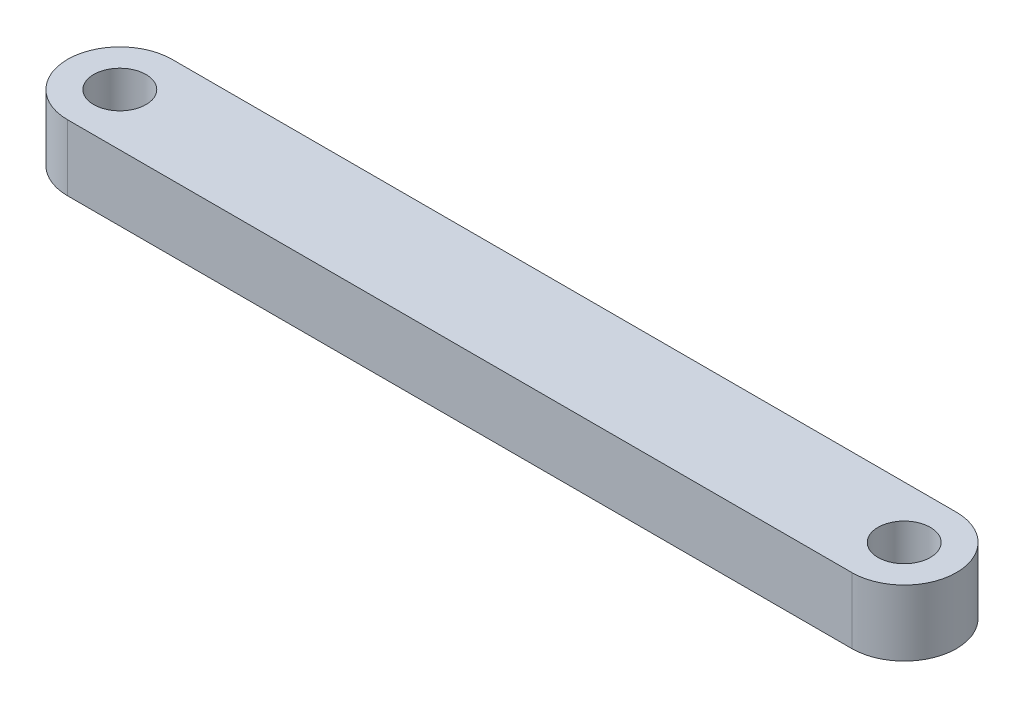
ISO-10303-21;
HEADER;
FILE_DESCRIPTION(('STEP AP214'),'2;1');
FILE_NAME('part.step','',(''),(''),'','','');
FILE_SCHEMA(('AUTOMOTIVE_DESIGN { 1 0 10303 214 1 1 1 1 }'));
ENDSEC;
DATA;
#1=APPLICATION_CONTEXT('core data for automotive mechanical design processes');
#2=APPLICATION_PROTOCOL_DEFINITION('international standard','automotive_design',2000,#1);
#3=PRODUCT_CONTEXT('',#1,'mechanical');
#4=PRODUCT('Part','Part','',(#3));
#5=PRODUCT_RELATED_PRODUCT_CATEGORY('part','',(#4));
#6=PRODUCT_DEFINITION_FORMATION('','',#4);
#7=PRODUCT_DEFINITION_CONTEXT('part definition',#1,'design');
#8=PRODUCT_DEFINITION('design','',#6,#7);
#9=PRODUCT_DEFINITION_SHAPE('','',#8);
#10=(LENGTH_UNIT() NAMED_UNIT(*) SI_UNIT(.MILLI.,.METRE.));
#11=(NAMED_UNIT(*) PLANE_ANGLE_UNIT() SI_UNIT($,.RADIAN.));
#12=(NAMED_UNIT(*) SI_UNIT($,.STERADIAN.) SOLID_ANGLE_UNIT());
#13=UNCERTAINTY_MEASURE_WITH_UNIT(LENGTH_MEASURE(1.E-05),#10,'distance_accuracy_value','');
#14=(GEOMETRIC_REPRESENTATION_CONTEXT(3) GLOBAL_UNCERTAINTY_ASSIGNED_CONTEXT((#13)) GLOBAL_UNIT_ASSIGNED_CONTEXT((#10,
#11,#12)) REPRESENTATION_CONTEXT('',''));
#15=CARTESIAN_POINT('',(0.,0.,0.));
#16=DIRECTION('',(0.,0.,1.));
#17=DIRECTION('',(1.,0.,0.));
#18=AXIS2_PLACEMENT_3D('',#15,#16,#17);
#19=CARTESIAN_POINT('',(6.35000000000001,3.2004,0.));
#20=DIRECTION('',(0.,1.,0.));
#21=DIRECTION('',(0.,0.,1.));
#22=AXIS2_PLACEMENT_3D('',#19,#20,#21);
#23=PLANE('',#22);
#24=CARTESIAN_POINT('',(-31.75,3.2004,0.));
#25=DIRECTION('',(0.,1.,0.));
#26=DIRECTION('',(0.,0.,1.));
#27=AXIS2_PLACEMENT_3D('',#24,#25,#26);
#28=CIRCLE('',#27,1.27);
#29=CARTESIAN_POINT('',(-31.75,3.2004,1.27));
#30=VERTEX_POINT('',#29);
#31=EDGE_CURVE('E100',#30,#30,#28,.T.);
#32=ORIENTED_EDGE('',*,*,#31,.F.);
#33=EDGE_LOOP('',(#32));
#34=FACE_BOUND('',#33,.T.);
#35=CARTESIAN_POINT('',(6.35000000000001,3.2004,0.));
#36=DIRECTION('',(0.,1.,0.));
#37=DIRECTION('',(0.,0.,1.));
#38=AXIS2_PLACEMENT_3D('',#35,#36,#37);
#39=CIRCLE('',#38,2.54);
#40=CARTESIAN_POINT('',(6.35000000000001,3.2004,2.54));
#41=VERTEX_POINT('',#40);
#42=CARTESIAN_POINT('',(6.35000000000001,3.2004,-2.54));
#43=VERTEX_POINT('',#42);
#44=EDGE_CURVE('E85',#41,#43,#39,.T.);
#45=ORIENTED_EDGE('',*,*,#44,.T.);
#46=DIRECTION('',(-1.,0.,0.));
#47=VECTOR('',#46,1.);
#48=CARTESIAN_POINT('',(-31.75,3.2004,-2.54));
#49=LINE('',#48,#47);
#50=CARTESIAN_POINT('',(-31.75,3.2004,-2.54));
#51=VERTEX_POINT('',#50);
#52=EDGE_CURVE('E80',#43,#51,#49,.T.);
#53=ORIENTED_EDGE('',*,*,#52,.T.);
#54=CARTESIAN_POINT('',(-31.75,3.2004,0.));
#55=DIRECTION('',(0.,1.,0.));
#56=DIRECTION('',(0.,0.,1.));
#57=AXIS2_PLACEMENT_3D('',#54,#55,#56);
#58=CIRCLE('',#57,2.54);
#59=CARTESIAN_POINT('',(-31.75,3.2004,2.54));
#60=VERTEX_POINT('',#59);
#61=EDGE_CURVE('E83',#51,#60,#58,.T.);
#62=ORIENTED_EDGE('',*,*,#61,.T.);
#63=DIRECTION('',(1.,0.,0.));
#64=VECTOR('',#63,1.);
#65=CARTESIAN_POINT('',(-31.75,3.2004,2.54));
#66=LINE('',#65,#64);
#67=EDGE_CURVE('E50',#60,#41,#66,.T.);
#68=ORIENTED_EDGE('',*,*,#67,.T.);
#69=EDGE_LOOP('',(#45,#53,#62,#68));
#70=FACE_BOUND('',#69,.T.);
#71=CARTESIAN_POINT('',(6.35000000000001,3.2004,0.));
#72=DIRECTION('',(0.,1.,0.));
#73=DIRECTION('',(0.,0.,1.));
#74=AXIS2_PLACEMENT_3D('',#71,#72,#73);
#75=CIRCLE('',#74,1.27);
#76=CARTESIAN_POINT('',(6.35000000000001,3.2004,1.27));
#77=VERTEX_POINT('',#76);
#78=EDGE_CURVE('E115',#77,#77,#75,.T.);
#79=ORIENTED_EDGE('',*,*,#78,.F.);
#80=EDGE_LOOP('',(#79));
#81=FACE_BOUND('',#80,.T.);
#82=ADVANCED_FACE('F33',(#34,#70,#81),#23,.T.);
#83=CARTESIAN_POINT('',(6.35000000000001,0.,0.));
#84=DIRECTION('',(0.,1.,0.));
#85=DIRECTION('',(0.,0.,1.));
#86=AXIS2_PLACEMENT_3D('',#83,#84,#85);
#87=PLANE('',#86);
#88=CARTESIAN_POINT('',(-31.75,0.,0.));
#89=DIRECTION('',(0.,1.,0.));
#90=DIRECTION('',(0.,0.,1.));
#91=AXIS2_PLACEMENT_3D('',#88,#89,#90);
#92=CIRCLE('',#91,1.27);
#93=CARTESIAN_POINT('',(-31.75,0.,1.27));
#94=VERTEX_POINT('',#93);
#95=EDGE_CURVE('E112',#94,#94,#92,.T.);
#96=ORIENTED_EDGE('',*,*,#95,.T.);
#97=EDGE_LOOP('',(#96));
#98=FACE_BOUND('',#97,.T.);
#99=CARTESIAN_POINT('',(6.35000000000001,0.,0.));
#100=DIRECTION('',(0.,1.,0.));
#101=DIRECTION('',(0.,0.,1.));
#102=AXIS2_PLACEMENT_3D('',#99,#100,#101);
#103=CIRCLE('',#102,2.54);
#104=CARTESIAN_POINT('',(6.35000000000001,0.,2.54));
#105=VERTEX_POINT('',#104);
#106=CARTESIAN_POINT('',(6.35000000000001,0.,-2.54));
#107=VERTEX_POINT('',#106);
#108=EDGE_CURVE('E97',#105,#107,#103,.T.);
#109=ORIENTED_EDGE('',*,*,#108,.F.);
#110=DIRECTION('',(1.,0.,0.));
#111=VECTOR('',#110,1.);
#112=CARTESIAN_POINT('',(-31.75,0.,2.54));
#113=LINE('',#112,#111);
#114=CARTESIAN_POINT('',(-31.75,0.,2.54));
#115=VERTEX_POINT('',#114);
#116=EDGE_CURVE('E73',#115,#105,#113,.T.);
#117=ORIENTED_EDGE('',*,*,#116,.F.);
#118=CARTESIAN_POINT('',(-31.75,0.,0.));
#119=DIRECTION('',(0.,1.,0.));
#120=DIRECTION('',(0.,0.,1.));
#121=AXIS2_PLACEMENT_3D('',#118,#119,#120);
#122=CIRCLE('',#121,2.54);
#123=CARTESIAN_POINT('',(-31.75,0.,-2.54));
#124=VERTEX_POINT('',#123);
#125=EDGE_CURVE('E67',#124,#115,#122,.T.);
#126=ORIENTED_EDGE('',*,*,#125,.F.);
#127=DIRECTION('',(-1.,0.,0.));
#128=VECTOR('',#127,1.);
#129=CARTESIAN_POINT('',(-31.75,0.,-2.54));
#130=LINE('',#129,#128);
#131=EDGE_CURVE('E89',#107,#124,#130,.T.);
#132=ORIENTED_EDGE('',*,*,#131,.F.);
#133=EDGE_LOOP('',(#109,#117,#126,#132));
#134=FACE_BOUND('',#133,.T.);
#135=CARTESIAN_POINT('',(6.35000000000001,0.,0.));
#136=DIRECTION('',(0.,1.,0.));
#137=DIRECTION('',(0.,0.,1.));
#138=AXIS2_PLACEMENT_3D('',#135,#136,#137);
#139=CIRCLE('',#138,1.27);
#140=CARTESIAN_POINT('',(6.35000000000001,0.,1.27));
#141=VERTEX_POINT('',#140);
#142=EDGE_CURVE('E118',#141,#141,#139,.T.);
#143=ORIENTED_EDGE('',*,*,#142,.T.);
#144=EDGE_LOOP('',(#143));
#145=FACE_BOUND('',#144,.T.);
#146=ADVANCED_FACE('F108',(#98,#134,#145),#87,.F.);
#147=CARTESIAN_POINT('',(6.35000000000001,3.2004,0.));
#148=DIRECTION('',(0.,-1.,0.));
#149=DIRECTION('',(0.,0.,-1.));
#150=AXIS2_PLACEMENT_3D('',#147,#148,#149);
#151=CYLINDRICAL_SURFACE('',#150,2.54);
#152=ORIENTED_EDGE('',*,*,#108,.T.);
#153=DIRECTION('',(0.,-1.,0.));
#154=VECTOR('',#153,1.);
#155=CARTESIAN_POINT('',(6.35000000000001,3.2004,-2.54));
#156=LINE('',#155,#154);
#157=EDGE_CURVE('E11',#43,#107,#156,.T.);
#158=ORIENTED_EDGE('',*,*,#157,.F.);
#159=ORIENTED_EDGE('',*,*,#44,.F.);
#160=DIRECTION('',(0.,-1.,0.));
#161=VECTOR('',#160,1.);
#162=CARTESIAN_POINT('',(6.35000000000001,3.2004,2.54));
#163=LINE('',#162,#161);
#164=EDGE_CURVE('E93',#41,#105,#163,.T.);
#165=ORIENTED_EDGE('',*,*,#164,.T.);
#166=EDGE_LOOP('',(#152,#158,#159,#165));
#167=FACE_BOUND('',#166,.T.);
#168=ADVANCED_FACE('F35',(#167),#151,.T.);
#169=CARTESIAN_POINT('',(-31.75,3.2004,-2.54));
#170=DIRECTION('',(0.,0.,1.));
#171=DIRECTION('',(1.,0.,0.));
#172=AXIS2_PLACEMENT_3D('',#169,#170,#171);
#173=PLANE('',#172);
#174=ORIENTED_EDGE('',*,*,#131,.T.);
#175=DIRECTION('',(0.,-1.,0.));
#176=VECTOR('',#175,1.);
#177=CARTESIAN_POINT('',(-31.75,3.2004,-2.54));
#178=LINE('',#177,#176);
#179=EDGE_CURVE('E42',#51,#124,#178,.T.);
#180=ORIENTED_EDGE('',*,*,#179,.F.);
#181=ORIENTED_EDGE('',*,*,#52,.F.);
#182=ORIENTED_EDGE('',*,*,#157,.T.);
#183=EDGE_LOOP('',(#174,#180,#181,#182));
#184=FACE_BOUND('',#183,.T.);
#185=ADVANCED_FACE('F88',(#184),#173,.F.);
#186=CARTESIAN_POINT('',(-31.75,3.2004,0.));
#187=DIRECTION('',(0.,-1.,0.));
#188=DIRECTION('',(0.,0.,-1.));
#189=AXIS2_PLACEMENT_3D('',#186,#187,#188);
#190=CYLINDRICAL_SURFACE('',#189,2.54);
#191=ORIENTED_EDGE('',*,*,#125,.T.);
#192=DIRECTION('',(0.,-1.,0.));
#193=VECTOR('',#192,1.);
#194=CARTESIAN_POINT('',(-31.75,3.2004,2.54));
#195=LINE('',#194,#193);
#196=EDGE_CURVE('E90',#60,#115,#195,.T.);
#197=ORIENTED_EDGE('',*,*,#196,.F.);
#198=ORIENTED_EDGE('',*,*,#61,.F.);
#199=ORIENTED_EDGE('',*,*,#179,.T.);
#200=EDGE_LOOP('',(#191,#197,#198,#199));
#201=FACE_BOUND('',#200,.T.);
#202=ADVANCED_FACE('F91',(#201),#190,.T.);
#203=CARTESIAN_POINT('',(-31.75,3.2004,2.54));
#204=DIRECTION('',(0.,0.,-1.));
#205=DIRECTION('',(-1.,0.,0.));
#206=AXIS2_PLACEMENT_3D('',#203,#204,#205);
#207=PLANE('',#206);
#208=ORIENTED_EDGE('',*,*,#116,.T.);
#209=ORIENTED_EDGE('',*,*,#164,.F.);
#210=ORIENTED_EDGE('',*,*,#67,.F.);
#211=ORIENTED_EDGE('',*,*,#196,.T.);
#212=EDGE_LOOP('',(#208,#209,#210,#211));
#213=FACE_BOUND('',#212,.T.);
#214=ADVANCED_FACE('F105',(#213),#207,.F.);
#215=CARTESIAN_POINT('',(-31.75,3.2004,0.));
#216=DIRECTION('',(0.,-1.,0.));
#217=DIRECTION('',(0.,0.,-1.));
#218=AXIS2_PLACEMENT_3D('',#215,#216,#217);
#219=CYLINDRICAL_SURFACE('',#218,1.27);
#220=ORIENTED_EDGE('',*,*,#31,.T.);
#221=EDGE_LOOP('',(#220));
#222=FACE_BOUND('',#221,.T.);
#223=ORIENTED_EDGE('',*,*,#95,.F.);
#224=EDGE_LOOP('',(#223));
#225=FACE_BOUND('',#224,.T.);
#226=ADVANCED_FACE('F136',(#222,#225),#219,.F.);
#227=CARTESIAN_POINT('',(6.35000000000001,3.2004,0.));
#228=DIRECTION('',(0.,-1.,0.));
#229=DIRECTION('',(0.,0.,-1.));
#230=AXIS2_PLACEMENT_3D('',#227,#228,#229);
#231=CYLINDRICAL_SURFACE('',#230,1.27);
#232=ORIENTED_EDGE('',*,*,#78,.T.);
#233=EDGE_LOOP('',(#232));
#234=FACE_BOUND('',#233,.T.);
#235=ORIENTED_EDGE('',*,*,#142,.F.);
#236=EDGE_LOOP('',(#235));
#237=FACE_BOUND('',#236,.T.);
#238=ADVANCED_FACE('F124',(#234,#237),#231,.F.);
#239=CLOSED_SHELL('',(#82,#146,#168,#185,#202,#214,#226,#238));
#240=MANIFOLD_SOLID_BREP('B2',#239);
#241=ADVANCED_BREP_SHAPE_REPRESENTATION('',(#18,#240),#14);
#242=SHAPE_DEFINITION_REPRESENTATION(#9,#241);
ENDSEC;
END-ISO-10303-21;
